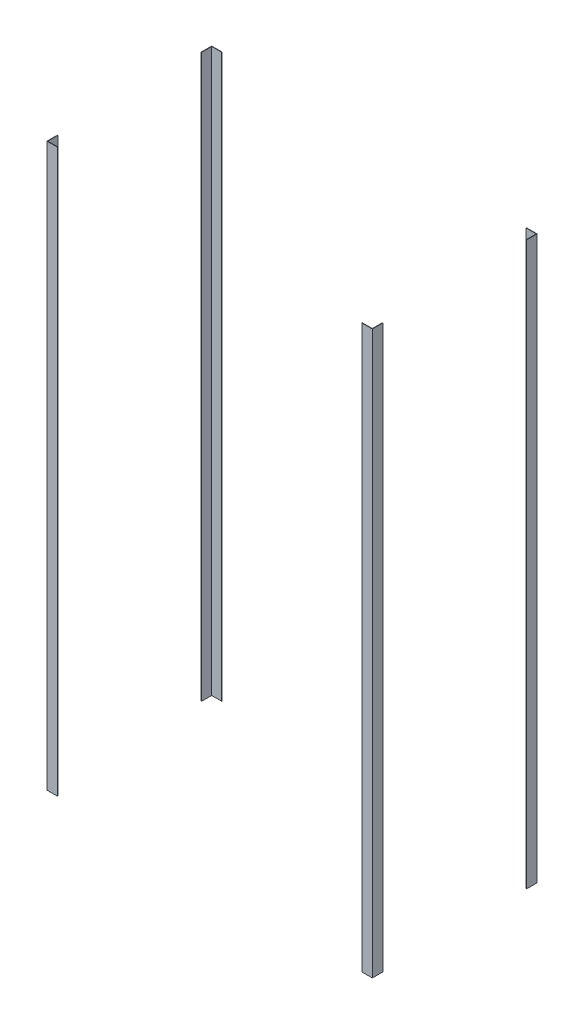
ISO-10303-21;
HEADER;
FILE_DESCRIPTION(('STEP AP214'),'2;1');
FILE_NAME('part.step','',(''),(''),'','','');
FILE_SCHEMA(('AUTOMOTIVE_DESIGN { 1 0 10303 214 1 1 1 1 }'));
ENDSEC;
DATA;
#1=APPLICATION_CONTEXT('core data for automotive mechanical design processes');
#2=APPLICATION_PROTOCOL_DEFINITION('international standard','automotive_design',2000,#1);
#3=PRODUCT_CONTEXT('',#1,'mechanical');
#4=PRODUCT('Part','Part','',(#3));
#5=PRODUCT_RELATED_PRODUCT_CATEGORY('part','',(#4));
#6=PRODUCT_DEFINITION_FORMATION('','',#4);
#7=PRODUCT_DEFINITION_CONTEXT('part definition',#1,'design');
#8=PRODUCT_DEFINITION('design','',#6,#7);
#9=PRODUCT_DEFINITION_SHAPE('','',#8);
#10=(LENGTH_UNIT() NAMED_UNIT(*) SI_UNIT(.MILLI.,.METRE.));
#11=(NAMED_UNIT(*) PLANE_ANGLE_UNIT() SI_UNIT($,.RADIAN.));
#12=(NAMED_UNIT(*) SI_UNIT($,.STERADIAN.) SOLID_ANGLE_UNIT());
#13=UNCERTAINTY_MEASURE_WITH_UNIT(LENGTH_MEASURE(1.E-05),#10,'distance_accuracy_value','');
#14=(GEOMETRIC_REPRESENTATION_CONTEXT(3) GLOBAL_UNCERTAINTY_ASSIGNED_CONTEXT((#13)) GLOBAL_UNIT_ASSIGNED_CONTEXT((#10,
#11,#12)) REPRESENTATION_CONTEXT('',''));
#15=CARTESIAN_POINT('',(0.,0.,0.));
#16=DIRECTION('',(0.,0.,1.));
#17=DIRECTION('',(1.,0.,0.));
#18=AXIS2_PLACEMENT_3D('',#15,#16,#17);
#19=CARTESIAN_POINT('',(577.85,2133.6,312.7375));
#20=DIRECTION('',(0.,0.,-1.));
#21=DIRECTION('',(-1.,0.,0.));
#22=AXIS2_PLACEMENT_3D('',#19,#20,#21);
#23=PLANE('',#22);
#24=DIRECTION('',(1.,0.,0.));
#25=VECTOR('',#24,1.);
#26=CARTESIAN_POINT('',(577.85,0.,312.7375));
#27=LINE('',#26,#25);
#28=CARTESIAN_POINT('',(577.85,0.,312.7375));
#29=VERTEX_POINT('',#28);
#30=CARTESIAN_POINT('',(617.5375,0.,312.7375));
#31=VERTEX_POINT('',#30);
#32=EDGE_CURVE('E12',#29,#31,#27,.T.);
#33=ORIENTED_EDGE('',*,*,#32,.T.);
#34=DIRECTION('',(0.,-1.,0.));
#35=VECTOR('',#34,1.);
#36=CARTESIAN_POINT('',(617.5375,2133.6,312.7375));
#37=LINE('',#36,#35);
#38=CARTESIAN_POINT('',(617.5375,2133.6,312.7375));
#39=VERTEX_POINT('',#38);
#40=EDGE_CURVE('E153',#39,#31,#37,.T.);
#41=ORIENTED_EDGE('',*,*,#40,.F.);
#42=DIRECTION('',(1.,0.,0.));
#43=VECTOR('',#42,1.);
#44=CARTESIAN_POINT('',(577.85,2133.6,312.7375));
#45=LINE('',#44,#43);
#46=CARTESIAN_POINT('',(577.85,2133.6,312.7375));
#47=VERTEX_POINT('',#46);
#48=EDGE_CURVE('E55',#47,#39,#45,.T.);
#49=ORIENTED_EDGE('',*,*,#48,.F.);
#50=DIRECTION('',(0.,-1.,0.));
#51=VECTOR('',#50,1.);
#52=CARTESIAN_POINT('',(577.85,2133.6,312.7375));
#53=LINE('',#52,#51);
#54=EDGE_CURVE('E141',#47,#29,#53,.T.);
#55=ORIENTED_EDGE('',*,*,#54,.T.);
#56=EDGE_LOOP('',(#33,#41,#49,#55));
#57=FACE_BOUND('',#56,.T.);
#58=ADVANCED_FACE('F51',(#57),#23,.F.);
#59=CARTESIAN_POINT('',(617.5375,2133.6,312.7375));
#60=DIRECTION('',(-1.,0.,0.));
#61=DIRECTION('',(0.,0.,1.));
#62=AXIS2_PLACEMENT_3D('',#59,#60,#61);
#63=PLANE('',#62);
#64=DIRECTION('',(0.,0.,-1.));
#65=VECTOR('',#64,1.);
#66=CARTESIAN_POINT('',(617.5375,0.,312.7375));
#67=LINE('',#66,#65);
#68=CARTESIAN_POINT('',(617.5375,0.,273.05));
#69=VERTEX_POINT('',#68);
#70=EDGE_CURVE('E61',#31,#69,#67,.T.);
#71=ORIENTED_EDGE('',*,*,#70,.T.);
#72=DIRECTION('',(0.,-1.,0.));
#73=VECTOR('',#72,1.);
#74=CARTESIAN_POINT('',(617.5375,2133.6,273.05));
#75=LINE('',#74,#73);
#76=CARTESIAN_POINT('',(617.5375,2133.6,273.05));
#77=VERTEX_POINT('',#76);
#78=EDGE_CURVE('E119',#77,#69,#75,.T.);
#79=ORIENTED_EDGE('',*,*,#78,.F.);
#80=DIRECTION('',(0.,0.,-1.));
#81=VECTOR('',#80,1.);
#82=CARTESIAN_POINT('',(617.5375,2133.6,312.7375));
#83=LINE('',#82,#81);
#84=EDGE_CURVE('E91',#39,#77,#83,.T.);
#85=ORIENTED_EDGE('',*,*,#84,.F.);
#86=ORIENTED_EDGE('',*,*,#40,.T.);
#87=EDGE_LOOP('',(#71,#79,#85,#86));
#88=FACE_BOUND('',#87,.T.);
#89=ADVANCED_FACE('F154',(#88),#63,.F.);
#90=CARTESIAN_POINT('',(615.95,2133.6,273.05));
#91=DIRECTION('',(0.,0.,1.));
#92=DIRECTION('',(1.,0.,0.));
#93=AXIS2_PLACEMENT_3D('',#90,#91,#92);
#94=PLANE('',#93);
#95=DIRECTION('',(-1.,0.,0.));
#96=VECTOR('',#95,1.);
#97=CARTESIAN_POINT('',(615.95,0.,273.05));
#98=LINE('',#97,#96);
#99=CARTESIAN_POINT('',(615.95,0.,273.05));
#100=VERTEX_POINT('',#99);
#101=EDGE_CURVE('E113',#69,#100,#98,.T.);
#102=ORIENTED_EDGE('',*,*,#101,.T.);
#103=DIRECTION('',(0.,-1.,0.));
#104=VECTOR('',#103,1.);
#105=CARTESIAN_POINT('',(615.95,2133.6,273.05));
#106=LINE('',#105,#104);
#107=CARTESIAN_POINT('',(615.95,2133.6,273.05));
#108=VERTEX_POINT('',#107);
#109=EDGE_CURVE('E117',#108,#100,#106,.T.);
#110=ORIENTED_EDGE('',*,*,#109,.F.);
#111=DIRECTION('',(-1.,0.,0.));
#112=VECTOR('',#111,1.);
#113=CARTESIAN_POINT('',(615.95,2133.6,273.05));
#114=LINE('',#113,#112);
#115=EDGE_CURVE('E144',#77,#108,#114,.T.);
#116=ORIENTED_EDGE('',*,*,#115,.F.);
#117=ORIENTED_EDGE('',*,*,#78,.T.);
#118=EDGE_LOOP('',(#102,#110,#116,#117));
#119=FACE_BOUND('',#118,.T.);
#120=ADVANCED_FACE('F115',(#119),#94,.F.);
#121=CARTESIAN_POINT('',(615.95,2133.6,311.15));
#122=DIRECTION('',(1.,0.,0.));
#123=DIRECTION('',(0.,0.,-1.));
#124=AXIS2_PLACEMENT_3D('',#121,#122,#123);
#125=PLANE('',#124);
#126=DIRECTION('',(0.,0.,1.));
#127=VECTOR('',#126,1.);
#128=CARTESIAN_POINT('',(615.95,0.,311.15));
#129=LINE('',#128,#127);
#130=CARTESIAN_POINT('',(615.95,0.,311.15));
#131=VERTEX_POINT('',#130);
#132=EDGE_CURVE('E121',#100,#131,#129,.T.);
#133=ORIENTED_EDGE('',*,*,#132,.T.);
#134=DIRECTION('',(0.,-1.,0.));
#135=VECTOR('',#134,1.);
#136=CARTESIAN_POINT('',(615.95,2133.6,311.15));
#137=LINE('',#136,#135);
#138=CARTESIAN_POINT('',(615.95,2133.6,311.15));
#139=VERTEX_POINT('',#138);
#140=EDGE_CURVE('E128',#139,#131,#137,.T.);
#141=ORIENTED_EDGE('',*,*,#140,.F.);
#142=DIRECTION('',(0.,0.,1.));
#143=VECTOR('',#142,1.);
#144=CARTESIAN_POINT('',(615.95,2133.6,311.15));
#145=LINE('',#144,#143);
#146=EDGE_CURVE('E127',#108,#139,#145,.T.);
#147=ORIENTED_EDGE('',*,*,#146,.F.);
#148=ORIENTED_EDGE('',*,*,#109,.T.);
#149=EDGE_LOOP('',(#133,#141,#147,#148));
#150=FACE_BOUND('',#149,.T.);
#151=ADVANCED_FACE('F124',(#150),#125,.F.);
#152=CARTESIAN_POINT('',(577.85,2133.6,311.15));
#153=DIRECTION('',(0.,0.,1.));
#154=DIRECTION('',(1.,0.,0.));
#155=AXIS2_PLACEMENT_3D('',#152,#153,#154);
#156=PLANE('',#155);
#157=DIRECTION('',(-1.,0.,0.));
#158=VECTOR('',#157,1.);
#159=CARTESIAN_POINT('',(577.85,0.,311.15));
#160=LINE('',#159,#158);
#161=CARTESIAN_POINT('',(577.85,0.,311.15));
#162=VERTEX_POINT('',#161);
#163=EDGE_CURVE('E132',#131,#162,#160,.T.);
#164=ORIENTED_EDGE('',*,*,#163,.T.);
#165=DIRECTION('',(0.,-1.,0.));
#166=VECTOR('',#165,1.);
#167=CARTESIAN_POINT('',(577.85,2133.6,311.15));
#168=LINE('',#167,#166);
#169=CARTESIAN_POINT('',(577.85,2133.6,311.15));
#170=VERTEX_POINT('',#169);
#171=EDGE_CURVE('E149',#170,#162,#168,.T.);
#172=ORIENTED_EDGE('',*,*,#171,.F.);
#173=DIRECTION('',(-1.,0.,0.));
#174=VECTOR('',#173,1.);
#175=CARTESIAN_POINT('',(577.85,2133.6,311.15));
#176=LINE('',#175,#174);
#177=EDGE_CURVE('E140',#139,#170,#176,.T.);
#178=ORIENTED_EDGE('',*,*,#177,.F.);
#179=ORIENTED_EDGE('',*,*,#140,.T.);
#180=EDGE_LOOP('',(#164,#172,#178,#179));
#181=FACE_BOUND('',#180,.T.);
#182=ADVANCED_FACE('F161',(#181),#156,.F.);
#183=CARTESIAN_POINT('',(577.85,2133.6,311.15));
#184=DIRECTION('',(1.,0.,0.));
#185=DIRECTION('',(0.,0.,-1.));
#186=AXIS2_PLACEMENT_3D('',#183,#184,#185);
#187=PLANE('',#186);
#188=DIRECTION('',(0.,0.,1.));
#189=VECTOR('',#188,1.);
#190=CARTESIAN_POINT('',(577.85,0.,311.15));
#191=LINE('',#190,#189);
#192=EDGE_CURVE('E102',#162,#29,#191,.T.);
#193=ORIENTED_EDGE('',*,*,#192,.T.);
#194=ORIENTED_EDGE('',*,*,#54,.F.);
#195=DIRECTION('',(0.,0.,1.));
#196=VECTOR('',#195,1.);
#197=CARTESIAN_POINT('',(577.85,2133.6,311.15));
#198=LINE('',#197,#196);
#199=EDGE_CURVE('E138',#170,#47,#198,.T.);
#200=ORIENTED_EDGE('',*,*,#199,.F.);
#201=ORIENTED_EDGE('',*,*,#171,.T.);
#202=EDGE_LOOP('',(#193,#194,#200,#201));
#203=FACE_BOUND('',#202,.T.);
#204=ADVANCED_FACE('F157',(#203),#187,.F.);
#205=CARTESIAN_POINT('',(0.,2133.6,0.));
#206=DIRECTION('',(0.,1.,0.));
#207=DIRECTION('',(0.,0.,1.));
#208=AXIS2_PLACEMENT_3D('',#205,#206,#207);
#209=PLANE('',#208);
#210=ORIENTED_EDGE('',*,*,#48,.T.);
#211=ORIENTED_EDGE('',*,*,#84,.T.);
#212=ORIENTED_EDGE('',*,*,#115,.T.);
#213=ORIENTED_EDGE('',*,*,#146,.T.);
#214=ORIENTED_EDGE('',*,*,#177,.T.);
#215=ORIENTED_EDGE('',*,*,#199,.T.);
#216=EDGE_LOOP('',(#210,#211,#212,#213,#214,#215));
#217=FACE_BOUND('',#216,.T.);
#218=ADVANCED_FACE('F53',(#217),#209,.T.);
#219=CARTESIAN_POINT('',(0.,0.,0.));
#220=DIRECTION('',(0.,1.,0.));
#221=DIRECTION('',(0.,0.,1.));
#222=AXIS2_PLACEMENT_3D('',#219,#220,#221);
#223=PLANE('',#222);
#224=ORIENTED_EDGE('',*,*,#32,.F.);
#225=ORIENTED_EDGE('',*,*,#192,.F.);
#226=ORIENTED_EDGE('',*,*,#163,.F.);
#227=ORIENTED_EDGE('',*,*,#132,.F.);
#228=ORIENTED_EDGE('',*,*,#101,.F.);
#229=ORIENTED_EDGE('',*,*,#70,.F.);
#230=EDGE_LOOP('',(#224,#225,#226,#227,#228,#229));
#231=FACE_BOUND('',#230,.T.);
#232=ADVANCED_FACE('F131',(#231),#223,.F.);
#233=CLOSED_SHELL('',(#58,#89,#120,#151,#182,#204,#218,#232));
#234=MANIFOLD_SOLID_BREP('B2',#233);
#235=CARTESIAN_POINT('',(-617.5375,2133.6,-273.05));
#236=DIRECTION('',(1.,0.,0.));
#237=DIRECTION('',(0.,0.,-1.));
#238=AXIS2_PLACEMENT_3D('',#235,#236,#237);
#239=PLANE('',#238);
#240=DIRECTION('',(0.,0.,1.));
#241=VECTOR('',#240,1.);
#242=CARTESIAN_POINT('',(-617.5375,0.,-273.05));
#243=LINE('',#242,#241);
#244=CARTESIAN_POINT('',(-617.5375,0.,-312.7375));
#245=VERTEX_POINT('',#244);
#246=CARTESIAN_POINT('',(-617.5375,0.,-273.05));
#247=VERTEX_POINT('',#246);
#248=EDGE_CURVE('E49',#245,#247,#243,.T.);
#249=ORIENTED_EDGE('',*,*,#248,.T.);
#250=DIRECTION('',(0.,-1.,0.));
#251=VECTOR('',#250,1.);
#252=CARTESIAN_POINT('',(-617.5375,2133.6,-273.05));
#253=LINE('',#252,#251);
#254=CARTESIAN_POINT('',(-617.5375,2133.6,-273.05));
#255=VERTEX_POINT('',#254);
#256=EDGE_CURVE('E370',#255,#247,#253,.T.);
#257=ORIENTED_EDGE('',*,*,#256,.F.);
#258=DIRECTION('',(0.,0.,1.));
#259=VECTOR('',#258,1.);
#260=CARTESIAN_POINT('',(-617.5375,2133.6,-273.05));
#261=LINE('',#260,#259);
#262=CARTESIAN_POINT('',(-617.5375,2133.6,-312.7375));
#263=VERTEX_POINT('',#262);
#264=EDGE_CURVE('E272',#263,#255,#261,.T.);
#265=ORIENTED_EDGE('',*,*,#264,.F.);
#266=DIRECTION('',(0.,-1.,0.));
#267=VECTOR('',#266,1.);
#268=CARTESIAN_POINT('',(-617.5375,2133.6,-312.7375));
#269=LINE('',#268,#267);
#270=EDGE_CURVE('E358',#263,#245,#269,.T.);
#271=ORIENTED_EDGE('',*,*,#270,.T.);
#272=EDGE_LOOP('',(#249,#257,#265,#271));
#273=FACE_BOUND('',#272,.T.);
#274=ADVANCED_FACE('F268',(#273),#239,.F.);
#275=CARTESIAN_POINT('',(-617.5375,2133.6,-273.05));
#276=DIRECTION('',(0.,0.,-1.));
#277=DIRECTION('',(-1.,0.,0.));
#278=AXIS2_PLACEMENT_3D('',#275,#276,#277);
#279=PLANE('',#278);
#280=DIRECTION('',(1.,0.,0.));
#281=VECTOR('',#280,1.);
#282=CARTESIAN_POINT('',(-617.5375,0.,-273.05));
#283=LINE('',#282,#281);
#284=CARTESIAN_POINT('',(-615.95,0.,-273.05));
#285=VERTEX_POINT('',#284);
#286=EDGE_CURVE('E278',#247,#285,#283,.T.);
#287=ORIENTED_EDGE('',*,*,#286,.T.);
#288=DIRECTION('',(0.,-1.,0.));
#289=VECTOR('',#288,1.);
#290=CARTESIAN_POINT('',(-615.95,2133.6,-273.05));
#291=LINE('',#290,#289);
#292=CARTESIAN_POINT('',(-615.95,2133.6,-273.05));
#293=VERTEX_POINT('',#292);
#294=EDGE_CURVE('E336',#293,#285,#291,.T.);
#295=ORIENTED_EDGE('',*,*,#294,.F.);
#296=DIRECTION('',(1.,0.,0.));
#297=VECTOR('',#296,1.);
#298=CARTESIAN_POINT('',(-617.5375,2133.6,-273.05));
#299=LINE('',#298,#297);
#300=EDGE_CURVE('E308',#255,#293,#299,.T.);
#301=ORIENTED_EDGE('',*,*,#300,.F.);
#302=ORIENTED_EDGE('',*,*,#256,.T.);
#303=EDGE_LOOP('',(#287,#295,#301,#302));
#304=FACE_BOUND('',#303,.T.);
#305=ADVANCED_FACE('F371',(#304),#279,.F.);
#306=CARTESIAN_POINT('',(-615.95,2133.6,-273.05));
#307=DIRECTION('',(-1.,0.,0.));
#308=DIRECTION('',(0.,0.,1.));
#309=AXIS2_PLACEMENT_3D('',#306,#307,#308);
#310=PLANE('',#309);
#311=DIRECTION('',(0.,0.,-1.));
#312=VECTOR('',#311,1.);
#313=CARTESIAN_POINT('',(-615.95,0.,-273.05));
#314=LINE('',#313,#312);
#315=CARTESIAN_POINT('',(-615.95,0.,-311.15));
#316=VERTEX_POINT('',#315);
#317=EDGE_CURVE('E330',#285,#316,#314,.T.);
#318=ORIENTED_EDGE('',*,*,#317,.T.);
#319=DIRECTION('',(0.,-1.,0.));
#320=VECTOR('',#319,1.);
#321=CARTESIAN_POINT('',(-615.95,2133.6,-311.15));
#322=LINE('',#321,#320);
#323=CARTESIAN_POINT('',(-615.95,2133.6,-311.15));
#324=VERTEX_POINT('',#323);
#325=EDGE_CURVE('E334',#324,#316,#322,.T.);
#326=ORIENTED_EDGE('',*,*,#325,.F.);
#327=DIRECTION('',(0.,0.,-1.));
#328=VECTOR('',#327,1.);
#329=CARTESIAN_POINT('',(-615.95,2133.6,-273.05));
#330=LINE('',#329,#328);
#331=EDGE_CURVE('E361',#293,#324,#330,.T.);
#332=ORIENTED_EDGE('',*,*,#331,.F.);
#333=ORIENTED_EDGE('',*,*,#294,.T.);
#334=EDGE_LOOP('',(#318,#326,#332,#333));
#335=FACE_BOUND('',#334,.T.);
#336=ADVANCED_FACE('F332',(#335),#310,.F.);
#337=CARTESIAN_POINT('',(-615.95,2133.6,-311.15));
#338=DIRECTION('',(0.,0.,-1.));
#339=DIRECTION('',(-1.,0.,0.));
#340=AXIS2_PLACEMENT_3D('',#337,#338,#339);
#341=PLANE('',#340);
#342=DIRECTION('',(1.,0.,0.));
#343=VECTOR('',#342,1.);
#344=CARTESIAN_POINT('',(-615.95,0.,-311.15));
#345=LINE('',#344,#343);
#346=CARTESIAN_POINT('',(-577.85,0.,-311.15));
#347=VERTEX_POINT('',#346);
#348=EDGE_CURVE('E338',#316,#347,#345,.T.);
#349=ORIENTED_EDGE('',*,*,#348,.T.);
#350=DIRECTION('',(0.,-1.,0.));
#351=VECTOR('',#350,1.);
#352=CARTESIAN_POINT('',(-577.85,2133.6,-311.15));
#353=LINE('',#352,#351);
#354=CARTESIAN_POINT('',(-577.85,2133.6,-311.15));
#355=VERTEX_POINT('',#354);
#356=EDGE_CURVE('E345',#355,#347,#353,.T.);
#357=ORIENTED_EDGE('',*,*,#356,.F.);
#358=DIRECTION('',(1.,0.,0.));
#359=VECTOR('',#358,1.);
#360=CARTESIAN_POINT('',(-615.95,2133.6,-311.15));
#361=LINE('',#360,#359);
#362=EDGE_CURVE('E344',#324,#355,#361,.T.);
#363=ORIENTED_EDGE('',*,*,#362,.F.);
#364=ORIENTED_EDGE('',*,*,#325,.T.);
#365=EDGE_LOOP('',(#349,#357,#363,#364));
#366=FACE_BOUND('',#365,.T.);
#367=ADVANCED_FACE('F341',(#366),#341,.F.);
#368=CARTESIAN_POINT('',(-577.85,2133.6,-312.7375));
#369=DIRECTION('',(-1.,0.,0.));
#370=DIRECTION('',(0.,0.,1.));
#371=AXIS2_PLACEMENT_3D('',#368,#369,#370);
#372=PLANE('',#371);
#373=DIRECTION('',(0.,0.,-1.));
#374=VECTOR('',#373,1.);
#375=CARTESIAN_POINT('',(-577.85,0.,-312.7375));
#376=LINE('',#375,#374);
#377=CARTESIAN_POINT('',(-577.85,0.,-312.7375));
#378=VERTEX_POINT('',#377);
#379=EDGE_CURVE('E349',#347,#378,#376,.T.);
#380=ORIENTED_EDGE('',*,*,#379,.T.);
#381=DIRECTION('',(0.,-1.,0.));
#382=VECTOR('',#381,1.);
#383=CARTESIAN_POINT('',(-577.85,2133.6,-312.7375));
#384=LINE('',#383,#382);
#385=CARTESIAN_POINT('',(-577.85,2133.6,-312.7375));
#386=VERTEX_POINT('',#385);
#387=EDGE_CURVE('E366',#386,#378,#384,.T.);
#388=ORIENTED_EDGE('',*,*,#387,.F.);
#389=DIRECTION('',(0.,0.,-1.));
#390=VECTOR('',#389,1.);
#391=CARTESIAN_POINT('',(-577.85,2133.6,-312.7375));
#392=LINE('',#391,#390);
#393=EDGE_CURVE('E357',#355,#386,#392,.T.);
#394=ORIENTED_EDGE('',*,*,#393,.F.);
#395=ORIENTED_EDGE('',*,*,#356,.T.);
#396=EDGE_LOOP('',(#380,#388,#394,#395));
#397=FACE_BOUND('',#396,.T.);
#398=ADVANCED_FACE('F378',(#397),#372,.F.);
#399=CARTESIAN_POINT('',(-617.5375,2133.6,-312.7375));
#400=DIRECTION('',(0.,0.,1.));
#401=DIRECTION('',(1.,0.,0.));
#402=AXIS2_PLACEMENT_3D('',#399,#400,#401);
#403=PLANE('',#402);
#404=DIRECTION('',(-1.,0.,0.));
#405=VECTOR('',#404,1.);
#406=CARTESIAN_POINT('',(-617.5375,0.,-312.7375));
#407=LINE('',#406,#405);
#408=EDGE_CURVE('E319',#378,#245,#407,.T.);
#409=ORIENTED_EDGE('',*,*,#408,.T.);
#410=ORIENTED_EDGE('',*,*,#270,.F.);
#411=DIRECTION('',(-1.,0.,0.));
#412=VECTOR('',#411,1.);
#413=CARTESIAN_POINT('',(-617.5375,2133.6,-312.7375));
#414=LINE('',#413,#412);
#415=EDGE_CURVE('E355',#386,#263,#414,.T.);
#416=ORIENTED_EDGE('',*,*,#415,.F.);
#417=ORIENTED_EDGE('',*,*,#387,.T.);
#418=EDGE_LOOP('',(#409,#410,#416,#417));
#419=FACE_BOUND('',#418,.T.);
#420=ADVANCED_FACE('F374',(#419),#403,.F.);
#421=CARTESIAN_POINT('',(0.,2133.6,0.));
#422=DIRECTION('',(0.,-1.,0.));
#423=DIRECTION('',(0.,0.,-1.));
#424=AXIS2_PLACEMENT_3D('',#421,#422,#423);
#425=PLANE('',#424);
#426=ORIENTED_EDGE('',*,*,#264,.T.);
#427=ORIENTED_EDGE('',*,*,#300,.T.);
#428=ORIENTED_EDGE('',*,*,#331,.T.);
#429=ORIENTED_EDGE('',*,*,#362,.T.);
#430=ORIENTED_EDGE('',*,*,#393,.T.);
#431=ORIENTED_EDGE('',*,*,#415,.T.);
#432=EDGE_LOOP('',(#426,#427,#428,#429,#430,#431));
#433=FACE_BOUND('',#432,.T.);
#434=ADVANCED_FACE('F270',(#433),#425,.F.);
#435=CARTESIAN_POINT('',(0.,0.,0.));
#436=DIRECTION('',(0.,-1.,0.));
#437=DIRECTION('',(0.,0.,-1.));
#438=AXIS2_PLACEMENT_3D('',#435,#436,#437);
#439=PLANE('',#438);
#440=ORIENTED_EDGE('',*,*,#248,.F.);
#441=ORIENTED_EDGE('',*,*,#408,.F.);
#442=ORIENTED_EDGE('',*,*,#379,.F.);
#443=ORIENTED_EDGE('',*,*,#348,.F.);
#444=ORIENTED_EDGE('',*,*,#317,.F.);
#445=ORIENTED_EDGE('',*,*,#286,.F.);
#446=EDGE_LOOP('',(#440,#441,#442,#443,#444,#445));
#447=FACE_BOUND('',#446,.T.);
#448=ADVANCED_FACE('F348',(#447),#439,.T.);
#449=CLOSED_SHELL('',(#274,#305,#336,#367,#398,#420,#434,#448));
#450=MANIFOLD_SOLID_BREP('B6',#449);
#451=CARTESIAN_POINT('',(-617.5375,2133.6,312.7375));
#452=DIRECTION('',(1.,0.,0.));
#453=DIRECTION('',(0.,0.,-1.));
#454=AXIS2_PLACEMENT_3D('',#451,#452,#453);
#455=PLANE('',#454);
#456=DIRECTION('',(0.,0.,1.));
#457=VECTOR('',#456,1.);
#458=CARTESIAN_POINT('',(-617.5375,0.,312.7375));
#459=LINE('',#458,#457);
#460=CARTESIAN_POINT('',(-617.5375,0.,273.05));
#461=VERTEX_POINT('',#460);
#462=CARTESIAN_POINT('',(-617.5375,0.,312.7375));
#463=VERTEX_POINT('',#462);
#464=EDGE_CURVE('E266',#461,#463,#459,.T.);
#465=ORIENTED_EDGE('',*,*,#464,.T.);
#466=DIRECTION('',(0.,-1.,0.));
#467=VECTOR('',#466,1.);
#468=CARTESIAN_POINT('',(-617.5375,2133.6,312.7375));
#469=LINE('',#468,#467);
#470=CARTESIAN_POINT('',(-617.5375,2133.6,312.7375));
#471=VERTEX_POINT('',#470);
#472=EDGE_CURVE('E586',#471,#463,#469,.T.);
#473=ORIENTED_EDGE('',*,*,#472,.F.);
#474=DIRECTION('',(0.,0.,1.));
#475=VECTOR('',#474,1.);
#476=CARTESIAN_POINT('',(-617.5375,2133.6,312.7375));
#477=LINE('',#476,#475);
#478=CARTESIAN_POINT('',(-617.5375,2133.6,273.05));
#479=VERTEX_POINT('',#478);
#480=EDGE_CURVE('E488',#479,#471,#477,.T.);
#481=ORIENTED_EDGE('',*,*,#480,.F.);
#482=DIRECTION('',(0.,-1.,0.));
#483=VECTOR('',#482,1.);
#484=CARTESIAN_POINT('',(-617.5375,2133.6,273.05));
#485=LINE('',#484,#483);
#486=EDGE_CURVE('E574',#479,#461,#485,.T.);
#487=ORIENTED_EDGE('',*,*,#486,.T.);
#488=EDGE_LOOP('',(#465,#473,#481,#487));
#489=FACE_BOUND('',#488,.T.);
#490=ADVANCED_FACE('F484',(#489),#455,.F.);
#491=CARTESIAN_POINT('',(-617.5375,2133.6,312.7375));
#492=DIRECTION('',(0.,0.,-1.));
#493=DIRECTION('',(-1.,0.,0.));
#494=AXIS2_PLACEMENT_3D('',#491,#492,#493);
#495=PLANE('',#494);
#496=DIRECTION('',(1.,0.,0.));
#497=VECTOR('',#496,1.);
#498=CARTESIAN_POINT('',(-617.5375,0.,312.7375));
#499=LINE('',#498,#497);
#500=CARTESIAN_POINT('',(-577.85,0.,312.7375));
#501=VERTEX_POINT('',#500);
#502=EDGE_CURVE('E494',#463,#501,#499,.T.);
#503=ORIENTED_EDGE('',*,*,#502,.T.);
#504=DIRECTION('',(0.,-1.,0.));
#505=VECTOR('',#504,1.);
#506=CARTESIAN_POINT('',(-577.85,2133.6,312.7375));
#507=LINE('',#506,#505);
#508=CARTESIAN_POINT('',(-577.85,2133.6,312.7375));
#509=VERTEX_POINT('',#508);
#510=EDGE_CURVE('E552',#509,#501,#507,.T.);
#511=ORIENTED_EDGE('',*,*,#510,.F.);
#512=DIRECTION('',(1.,0.,0.));
#513=VECTOR('',#512,1.);
#514=CARTESIAN_POINT('',(-617.5375,2133.6,312.7375));
#515=LINE('',#514,#513);
#516=EDGE_CURVE('E524',#471,#509,#515,.T.);
#517=ORIENTED_EDGE('',*,*,#516,.F.);
#518=ORIENTED_EDGE('',*,*,#472,.T.);
#519=EDGE_LOOP('',(#503,#511,#517,#518));
#520=FACE_BOUND('',#519,.T.);
#521=ADVANCED_FACE('F587',(#520),#495,.F.);
#522=CARTESIAN_POINT('',(-577.85,2133.6,311.15));
#523=DIRECTION('',(-1.,0.,0.));
#524=DIRECTION('',(0.,0.,1.));
#525=AXIS2_PLACEMENT_3D('',#522,#523,#524);
#526=PLANE('',#525);
#527=DIRECTION('',(0.,0.,-1.));
#528=VECTOR('',#527,1.);
#529=CARTESIAN_POINT('',(-577.85,0.,311.15));
#530=LINE('',#529,#528);
#531=CARTESIAN_POINT('',(-577.85,0.,311.15));
#532=VERTEX_POINT('',#531);
#533=EDGE_CURVE('E546',#501,#532,#530,.T.);
#534=ORIENTED_EDGE('',*,*,#533,.T.);
#535=DIRECTION('',(0.,-1.,0.));
#536=VECTOR('',#535,1.);
#537=CARTESIAN_POINT('',(-577.85,2133.6,311.15));
#538=LINE('',#537,#536);
#539=CARTESIAN_POINT('',(-577.85,2133.6,311.15));
#540=VERTEX_POINT('',#539);
#541=EDGE_CURVE('E550',#540,#532,#538,.T.);
#542=ORIENTED_EDGE('',*,*,#541,.F.);
#543=DIRECTION('',(0.,0.,-1.));
#544=VECTOR('',#543,1.);
#545=CARTESIAN_POINT('',(-577.85,2133.6,311.15));
#546=LINE('',#545,#544);
#547=EDGE_CURVE('E577',#509,#540,#546,.T.);
#548=ORIENTED_EDGE('',*,*,#547,.F.);
#549=ORIENTED_EDGE('',*,*,#510,.T.);
#550=EDGE_LOOP('',(#534,#542,#548,#549));
#551=FACE_BOUND('',#550,.T.);
#552=ADVANCED_FACE('F548',(#551),#526,.F.);
#553=CARTESIAN_POINT('',(-615.95,2133.6,311.15));
#554=DIRECTION('',(0.,0.,1.));
#555=DIRECTION('',(1.,0.,0.));
#556=AXIS2_PLACEMENT_3D('',#553,#554,#555);
#557=PLANE('',#556);
#558=DIRECTION('',(-1.,0.,0.));
#559=VECTOR('',#558,1.);
#560=CARTESIAN_POINT('',(-615.95,0.,311.15));
#561=LINE('',#560,#559);
#562=CARTESIAN_POINT('',(-615.95,0.,311.15));
#563=VERTEX_POINT('',#562);
#564=EDGE_CURVE('E554',#532,#563,#561,.T.);
#565=ORIENTED_EDGE('',*,*,#564,.T.);
#566=DIRECTION('',(0.,-1.,0.));
#567=VECTOR('',#566,1.);
#568=CARTESIAN_POINT('',(-615.95,2133.6,311.15));
#569=LINE('',#568,#567);
#570=CARTESIAN_POINT('',(-615.95,2133.6,311.15));
#571=VERTEX_POINT('',#570);
#572=EDGE_CURVE('E561',#571,#563,#569,.T.);
#573=ORIENTED_EDGE('',*,*,#572,.F.);
#574=DIRECTION('',(-1.,0.,0.));
#575=VECTOR('',#574,1.);
#576=CARTESIAN_POINT('',(-615.95,2133.6,311.15));
#577=LINE('',#576,#575);
#578=EDGE_CURVE('E560',#540,#571,#577,.T.);
#579=ORIENTED_EDGE('',*,*,#578,.F.);
#580=ORIENTED_EDGE('',*,*,#541,.T.);
#581=EDGE_LOOP('',(#565,#573,#579,#580));
#582=FACE_BOUND('',#581,.T.);
#583=ADVANCED_FACE('F557',(#582),#557,.F.);
#584=CARTESIAN_POINT('',(-615.95,2133.6,311.15));
#585=DIRECTION('',(-1.,0.,0.));
#586=DIRECTION('',(0.,0.,1.));
#587=AXIS2_PLACEMENT_3D('',#584,#585,#586);
#588=PLANE('',#587);
#589=DIRECTION('',(0.,0.,-1.));
#590=VECTOR('',#589,1.);
#591=CARTESIAN_POINT('',(-615.95,0.,311.15));
#592=LINE('',#591,#590);
#593=CARTESIAN_POINT('',(-615.95,0.,273.05));
#594=VERTEX_POINT('',#593);
#595=EDGE_CURVE('E565',#563,#594,#592,.T.);
#596=ORIENTED_EDGE('',*,*,#595,.T.);
#597=DIRECTION('',(0.,-1.,0.));
#598=VECTOR('',#597,1.);
#599=CARTESIAN_POINT('',(-615.95,2133.6,273.05));
#600=LINE('',#599,#598);
#601=CARTESIAN_POINT('',(-615.95,2133.6,273.05));
#602=VERTEX_POINT('',#601);
#603=EDGE_CURVE('E582',#602,#594,#600,.T.);
#604=ORIENTED_EDGE('',*,*,#603,.F.);
#605=DIRECTION('',(0.,0.,-1.));
#606=VECTOR('',#605,1.);
#607=CARTESIAN_POINT('',(-615.95,2133.6,311.15));
#608=LINE('',#607,#606);
#609=EDGE_CURVE('E573',#571,#602,#608,.T.);
#610=ORIENTED_EDGE('',*,*,#609,.F.);
#611=ORIENTED_EDGE('',*,*,#572,.T.);
#612=EDGE_LOOP('',(#596,#604,#610,#611));
#613=FACE_BOUND('',#612,.T.);
#614=ADVANCED_FACE('F594',(#613),#588,.F.);
#615=CARTESIAN_POINT('',(-617.5375,2133.6,273.05));
#616=DIRECTION('',(0.,0.,1.));
#617=DIRECTION('',(1.,0.,0.));
#618=AXIS2_PLACEMENT_3D('',#615,#616,#617);
#619=PLANE('',#618);
#620=DIRECTION('',(-1.,0.,0.));
#621=VECTOR('',#620,1.);
#622=CARTESIAN_POINT('',(-617.5375,0.,273.05));
#623=LINE('',#622,#621);
#624=EDGE_CURVE('E535',#594,#461,#623,.T.);
#625=ORIENTED_EDGE('',*,*,#624,.T.);
#626=ORIENTED_EDGE('',*,*,#486,.F.);
#627=DIRECTION('',(-1.,0.,0.));
#628=VECTOR('',#627,1.);
#629=CARTESIAN_POINT('',(-617.5375,2133.6,273.05));
#630=LINE('',#629,#628);
#631=EDGE_CURVE('E571',#602,#479,#630,.T.);
#632=ORIENTED_EDGE('',*,*,#631,.F.);
#633=ORIENTED_EDGE('',*,*,#603,.T.);
#634=EDGE_LOOP('',(#625,#626,#632,#633));
#635=FACE_BOUND('',#634,.T.);
#636=ADVANCED_FACE('F590',(#635),#619,.F.);
#637=CARTESIAN_POINT('',(0.,2133.6,0.));
#638=DIRECTION('',(0.,-1.,0.));
#639=DIRECTION('',(0.,0.,-1.));
#640=AXIS2_PLACEMENT_3D('',#637,#638,#639);
#641=PLANE('',#640);
#642=ORIENTED_EDGE('',*,*,#480,.T.);
#643=ORIENTED_EDGE('',*,*,#516,.T.);
#644=ORIENTED_EDGE('',*,*,#547,.T.);
#645=ORIENTED_EDGE('',*,*,#578,.T.);
#646=ORIENTED_EDGE('',*,*,#609,.T.);
#647=ORIENTED_EDGE('',*,*,#631,.T.);
#648=EDGE_LOOP('',(#642,#643,#644,#645,#646,#647));
#649=FACE_BOUND('',#648,.T.);
#650=ADVANCED_FACE('F486',(#649),#641,.F.);
#651=CARTESIAN_POINT('',(0.,0.,0.));
#652=DIRECTION('',(0.,-1.,0.));
#653=DIRECTION('',(0.,0.,-1.));
#654=AXIS2_PLACEMENT_3D('',#651,#652,#653);
#655=PLANE('',#654);
#656=ORIENTED_EDGE('',*,*,#464,.F.);
#657=ORIENTED_EDGE('',*,*,#624,.F.);
#658=ORIENTED_EDGE('',*,*,#595,.F.);
#659=ORIENTED_EDGE('',*,*,#564,.F.);
#660=ORIENTED_EDGE('',*,*,#533,.F.);
#661=ORIENTED_EDGE('',*,*,#502,.F.);
#662=EDGE_LOOP('',(#656,#657,#658,#659,#660,#661));
#663=FACE_BOUND('',#662,.T.);
#664=ADVANCED_FACE('F564',(#663),#655,.T.);
#665=CLOSED_SHELL('',(#490,#521,#552,#583,#614,#636,#650,#664));
#666=MANIFOLD_SOLID_BREP('B43',#665);
#667=CARTESIAN_POINT('',(617.5375,2133.6,-273.05));
#668=DIRECTION('',(-1.,0.,0.));
#669=DIRECTION('',(0.,0.,1.));
#670=AXIS2_PLACEMENT_3D('',#667,#668,#669);
#671=PLANE('',#670);
#672=DIRECTION('',(0.,0.,-1.));
#673=VECTOR('',#672,1.);
#674=CARTESIAN_POINT('',(617.5375,0.,-273.05));
#675=LINE('',#674,#673);
#676=CARTESIAN_POINT('',(617.5375,0.,-273.05));
#677=VERTEX_POINT('',#676);
#678=CARTESIAN_POINT('',(617.5375,0.,-312.7375));
#679=VERTEX_POINT('',#678);
#680=EDGE_CURVE('E775',#677,#679,#675,.T.);
#681=ORIENTED_EDGE('',*,*,#680,.T.);
#682=DIRECTION('',(0.,-1.,0.));
#683=VECTOR('',#682,1.);
#684=CARTESIAN_POINT('',(617.5375,2133.6,-312.7375));
#685=LINE('',#684,#683);
#686=CARTESIAN_POINT('',(617.5375,2133.6,-312.7375));
#687=VERTEX_POINT('',#686);
#688=EDGE_CURVE('E482',#687,#679,#685,.T.);
#689=ORIENTED_EDGE('',*,*,#688,.F.);
#690=DIRECTION('',(0.,0.,-1.));
#691=VECTOR('',#690,1.);
#692=CARTESIAN_POINT('',(617.5375,2133.6,-273.05));
#693=LINE('',#692,#691);
#694=CARTESIAN_POINT('',(617.5375,2133.6,-273.05));
#695=VERTEX_POINT('',#694);
#696=EDGE_CURVE('E785',#695,#687,#693,.T.);
#697=ORIENTED_EDGE('',*,*,#696,.F.);
#698=DIRECTION('',(0.,-1.,0.));
#699=VECTOR('',#698,1.);
#700=CARTESIAN_POINT('',(617.5375,2133.6,-273.05));
#701=LINE('',#700,#699);
#702=EDGE_CURVE('E771',#695,#677,#701,.T.);
#703=ORIENTED_EDGE('',*,*,#702,.T.);
#704=EDGE_LOOP('',(#681,#689,#697,#703));
#705=FACE_BOUND('',#704,.T.);
#706=ADVANCED_FACE('F691',(#705),#671,.F.);
#707=CARTESIAN_POINT('',(577.85,2133.6,-312.7375));
#708=DIRECTION('',(0.,0.,1.));
#709=DIRECTION('',(1.,0.,0.));
#710=AXIS2_PLACEMENT_3D('',#707,#708,#709);
#711=PLANE('',#710);
#712=DIRECTION('',(-1.,0.,0.));
#713=VECTOR('',#712,1.);
#714=CARTESIAN_POINT('',(577.85,0.,-312.7375));
#715=LINE('',#714,#713);
#716=CARTESIAN_POINT('',(577.85,0.,-312.7375));
#717=VERTEX_POINT('',#716);
#718=EDGE_CURVE('E778',#679,#717,#715,.T.);
#719=ORIENTED_EDGE('',*,*,#718,.T.);
#720=DIRECTION('',(0.,-1.,0.));
#721=VECTOR('',#720,1.);
#722=CARTESIAN_POINT('',(577.85,2133.6,-312.7375));
#723=LINE('',#722,#721);
#724=CARTESIAN_POINT('',(577.85,2133.6,-312.7375));
#725=VERTEX_POINT('',#724);
#726=EDGE_CURVE('E699',#725,#717,#723,.T.);
#727=ORIENTED_EDGE('',*,*,#726,.F.);
#728=DIRECTION('',(-1.,0.,0.));
#729=VECTOR('',#728,1.);
#730=CARTESIAN_POINT('',(577.85,2133.6,-312.7375));
#731=LINE('',#730,#729);
#732=EDGE_CURVE('E744',#687,#725,#731,.T.);
#733=ORIENTED_EDGE('',*,*,#732,.F.);
#734=ORIENTED_EDGE('',*,*,#688,.T.);
#735=EDGE_LOOP('',(#719,#727,#733,#734));
#736=FACE_BOUND('',#735,.T.);
#737=ADVANCED_FACE('F809',(#736),#711,.F.);
#738=CARTESIAN_POINT('',(577.85,2133.6,-312.7375));
#739=DIRECTION('',(1.,0.,0.));
#740=DIRECTION('',(0.,0.,-1.));
#741=AXIS2_PLACEMENT_3D('',#738,#739,#740);
#742=PLANE('',#741);
#743=DIRECTION('',(0.,0.,1.));
#744=VECTOR('',#743,1.);
#745=CARTESIAN_POINT('',(577.85,0.,-312.7375));
#746=LINE('',#745,#744);
#747=CARTESIAN_POINT('',(577.85,0.,-311.15));
#748=VERTEX_POINT('',#747);
#749=EDGE_CURVE('E780',#717,#748,#746,.T.);
#750=ORIENTED_EDGE('',*,*,#749,.T.);
#751=DIRECTION('',(0.,-1.,0.));
#752=VECTOR('',#751,1.);
#753=CARTESIAN_POINT('',(577.85,2133.6,-311.15));
#754=LINE('',#753,#752);
#755=CARTESIAN_POINT('',(577.85,2133.6,-311.15));
#756=VERTEX_POINT('',#755);
#757=EDGE_CURVE('E766',#756,#748,#754,.T.);
#758=ORIENTED_EDGE('',*,*,#757,.F.);
#759=DIRECTION('',(0.,0.,1.));
#760=VECTOR('',#759,1.);
#761=CARTESIAN_POINT('',(577.85,2133.6,-312.7375));
#762=LINE('',#761,#760);
#763=EDGE_CURVE('E757',#725,#756,#762,.T.);
#764=ORIENTED_EDGE('',*,*,#763,.F.);
#765=ORIENTED_EDGE('',*,*,#726,.T.);
#766=EDGE_LOOP('',(#750,#758,#764,#765));
#767=FACE_BOUND('',#766,.T.);
#768=ADVANCED_FACE('F791',(#767),#742,.F.);
#769=CARTESIAN_POINT('',(577.85,2133.6,-311.15));
#770=DIRECTION('',(0.,0.,-1.));
#771=DIRECTION('',(-1.,0.,0.));
#772=AXIS2_PLACEMENT_3D('',#769,#770,#771);
#773=PLANE('',#772);
#774=DIRECTION('',(1.,0.,0.));
#775=VECTOR('',#774,1.);
#776=CARTESIAN_POINT('',(577.85,0.,-311.15));
#777=LINE('',#776,#775);
#778=CARTESIAN_POINT('',(615.95,0.,-311.15));
#779=VERTEX_POINT('',#778);
#780=EDGE_CURVE('E765',#748,#779,#777,.T.);
#781=ORIENTED_EDGE('',*,*,#780,.T.);
#782=DIRECTION('',(0.,-1.,0.));
#783=VECTOR('',#782,1.);
#784=CARTESIAN_POINT('',(615.95,2133.6,-311.15));
#785=LINE('',#784,#783);
#786=CARTESIAN_POINT('',(615.95,2133.6,-311.15));
#787=VERTEX_POINT('',#786);
#788=EDGE_CURVE('E762',#787,#779,#785,.T.);
#789=ORIENTED_EDGE('',*,*,#788,.F.);
#790=DIRECTION('',(1.,0.,0.));
#791=VECTOR('',#790,1.);
#792=CARTESIAN_POINT('',(577.85,2133.6,-311.15));
#793=LINE('',#792,#791);
#794=EDGE_CURVE('E751',#756,#787,#793,.T.);
#795=ORIENTED_EDGE('',*,*,#794,.F.);
#796=ORIENTED_EDGE('',*,*,#757,.T.);
#797=EDGE_LOOP('',(#781,#789,#795,#796));
#798=FACE_BOUND('',#797,.T.);
#799=ADVANCED_FACE('F763',(#798),#773,.F.);
#800=CARTESIAN_POINT('',(615.95,2133.6,-273.05));
#801=DIRECTION('',(1.,0.,0.));
#802=DIRECTION('',(0.,0.,-1.));
#803=AXIS2_PLACEMENT_3D('',#800,#801,#802);
#804=PLANE('',#803);
#805=DIRECTION('',(0.,0.,1.));
#806=VECTOR('',#805,1.);
#807=CARTESIAN_POINT('',(615.95,0.,-273.05));
#808=LINE('',#807,#806);
#809=CARTESIAN_POINT('',(615.95,0.,-273.05));
#810=VERTEX_POINT('',#809);
#811=EDGE_CURVE('E730',#779,#810,#808,.T.);
#812=ORIENTED_EDGE('',*,*,#811,.T.);
#813=DIRECTION('',(0.,-1.,0.));
#814=VECTOR('',#813,1.);
#815=CARTESIAN_POINT('',(615.95,2133.6,-273.05));
#816=LINE('',#815,#814);
#817=CARTESIAN_POINT('',(615.95,2133.6,-273.05));
#818=VERTEX_POINT('',#817);
#819=EDGE_CURVE('E767',#818,#810,#816,.T.);
#820=ORIENTED_EDGE('',*,*,#819,.F.);
#821=DIRECTION('',(0.,0.,1.));
#822=VECTOR('',#821,1.);
#823=CARTESIAN_POINT('',(615.95,2133.6,-273.05));
#824=LINE('',#823,#822);
#825=EDGE_CURVE('E755',#787,#818,#824,.T.);
#826=ORIENTED_EDGE('',*,*,#825,.F.);
#827=ORIENTED_EDGE('',*,*,#788,.T.);
#828=EDGE_LOOP('',(#812,#820,#826,#827));
#829=FACE_BOUND('',#828,.T.);
#830=ADVANCED_FACE('F769',(#829),#804,.F.);
#831=CARTESIAN_POINT('',(615.95,2133.6,-273.05));
#832=DIRECTION('',(0.,0.,-1.));
#833=DIRECTION('',(-1.,0.,0.));
#834=AXIS2_PLACEMENT_3D('',#831,#832,#833);
#835=PLANE('',#834);
#836=DIRECTION('',(1.,0.,0.));
#837=VECTOR('',#836,1.);
#838=CARTESIAN_POINT('',(615.95,0.,-273.05));
#839=LINE('',#838,#837);
#840=EDGE_CURVE('E736',#810,#677,#839,.T.);
#841=ORIENTED_EDGE('',*,*,#840,.T.);
#842=ORIENTED_EDGE('',*,*,#702,.F.);
#843=DIRECTION('',(1.,0.,0.));
#844=VECTOR('',#843,1.);
#845=CARTESIAN_POINT('',(615.95,2133.6,-273.05));
#846=LINE('',#845,#844);
#847=EDGE_CURVE('E707',#818,#695,#846,.T.);
#848=ORIENTED_EDGE('',*,*,#847,.F.);
#849=ORIENTED_EDGE('',*,*,#819,.T.);
#850=EDGE_LOOP('',(#841,#842,#848,#849));
#851=FACE_BOUND('',#850,.T.);
#852=ADVANCED_FACE('F798',(#851),#835,.F.);
#853=CARTESIAN_POINT('',(0.,2133.6,0.));
#854=DIRECTION('',(0.,-1.,0.));
#855=DIRECTION('',(0.,0.,-1.));
#856=AXIS2_PLACEMENT_3D('',#853,#854,#855);
#857=PLANE('',#856);
#858=ORIENTED_EDGE('',*,*,#696,.T.);
#859=ORIENTED_EDGE('',*,*,#732,.T.);
#860=ORIENTED_EDGE('',*,*,#763,.T.);
#861=ORIENTED_EDGE('',*,*,#794,.T.);
#862=ORIENTED_EDGE('',*,*,#825,.T.);
#863=ORIENTED_EDGE('',*,*,#847,.T.);
#864=EDGE_LOOP('',(#858,#859,#860,#861,#862,#863));
#865=FACE_BOUND('',#864,.T.);
#866=ADVANCED_FACE('F753',(#865),#857,.F.);
#867=CARTESIAN_POINT('',(0.,0.,0.));
#868=DIRECTION('',(0.,-1.,0.));
#869=DIRECTION('',(0.,0.,-1.));
#870=AXIS2_PLACEMENT_3D('',#867,#868,#869);
#871=PLANE('',#870);
#872=ORIENTED_EDGE('',*,*,#680,.F.);
#873=ORIENTED_EDGE('',*,*,#840,.F.);
#874=ORIENTED_EDGE('',*,*,#811,.F.);
#875=ORIENTED_EDGE('',*,*,#780,.F.);
#876=ORIENTED_EDGE('',*,*,#749,.F.);
#877=ORIENTED_EDGE('',*,*,#718,.F.);
#878=EDGE_LOOP('',(#872,#873,#874,#875,#876,#877));
#879=FACE_BOUND('',#878,.T.);
#880=ADVANCED_FACE('F794',(#879),#871,.T.);
#881=CLOSED_SHELL('',(#706,#737,#768,#799,#830,#852,#866,#880));
#882=MANIFOLD_SOLID_BREP('B260',#881);
#883=ADVANCED_BREP_SHAPE_REPRESENTATION('',(#18,#234,#450,#666,#882),#14);
#884=SHAPE_DEFINITION_REPRESENTATION(#9,#883);
ENDSEC;
END-ISO-10303-21;
